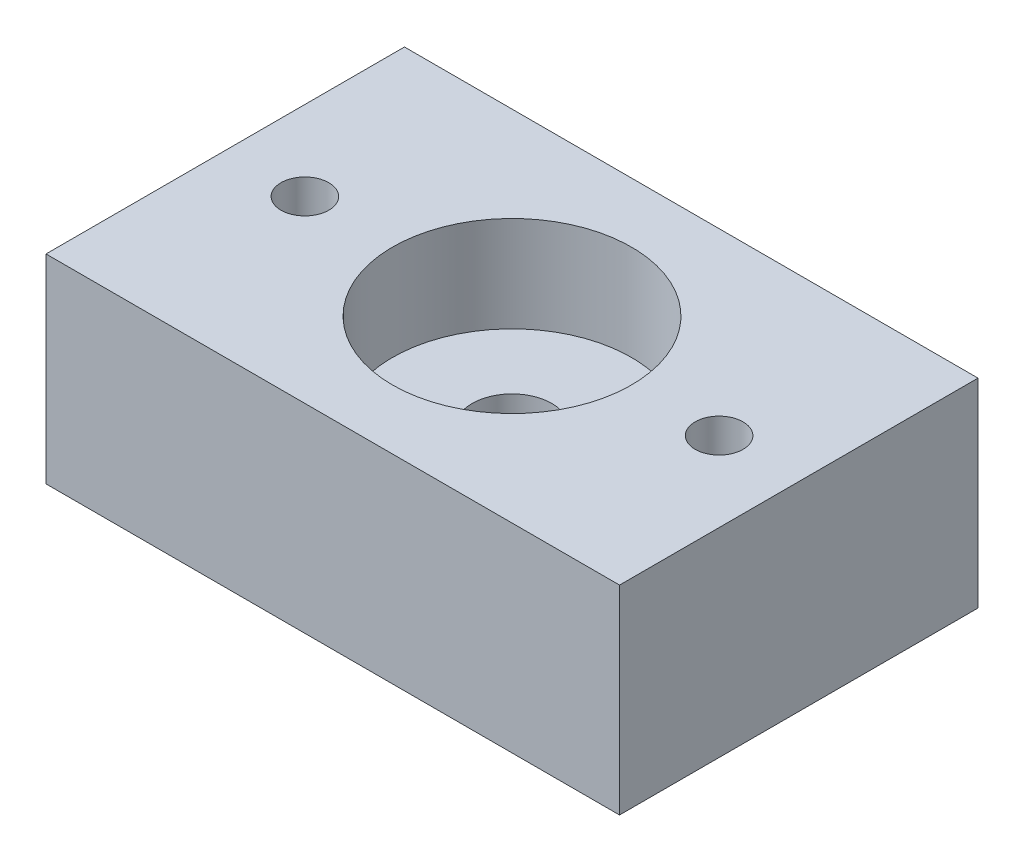
ISO-10303-21;
HEADER;
FILE_DESCRIPTION(('STEP AP214'),'2;1');
FILE_NAME('part.step','',(''),(''),'','','');
FILE_SCHEMA(('AUTOMOTIVE_DESIGN { 1 0 10303 214 1 1 1 1 }'));
ENDSEC;
DATA;
#1=APPLICATION_CONTEXT('core data for automotive mechanical design processes');
#2=APPLICATION_PROTOCOL_DEFINITION('international standard','automotive_design',2000,#1);
#3=PRODUCT_CONTEXT('',#1,'mechanical');
#4=PRODUCT('Part','Part','',(#3));
#5=PRODUCT_RELATED_PRODUCT_CATEGORY('part','',(#4));
#6=PRODUCT_DEFINITION_FORMATION('','',#4);
#7=PRODUCT_DEFINITION_CONTEXT('part definition',#1,'design');
#8=PRODUCT_DEFINITION('design','',#6,#7);
#9=PRODUCT_DEFINITION_SHAPE('','',#8);
#10=(LENGTH_UNIT() NAMED_UNIT(*) SI_UNIT(.MILLI.,.METRE.));
#11=(NAMED_UNIT(*) PLANE_ANGLE_UNIT() SI_UNIT($,.RADIAN.));
#12=(NAMED_UNIT(*) SI_UNIT($,.STERADIAN.) SOLID_ANGLE_UNIT());
#13=UNCERTAINTY_MEASURE_WITH_UNIT(LENGTH_MEASURE(1.E-05),#10,'distance_accuracy_value','');
#14=(GEOMETRIC_REPRESENTATION_CONTEXT(3) GLOBAL_UNCERTAINTY_ASSIGNED_CONTEXT((#13)) GLOBAL_UNIT_ASSIGNED_CONTEXT((#10,
#11,#12)) REPRESENTATION_CONTEXT('',''));
#15=CARTESIAN_POINT('',(0.,0.,0.));
#16=DIRECTION('',(0.,0.,1.));
#17=DIRECTION('',(1.,0.,0.));
#18=AXIS2_PLACEMENT_3D('',#15,#16,#17);
#19=CARTESIAN_POINT('',(0.,0.,0.));
#20=DIRECTION('',(0.,1.,0.));
#21=DIRECTION('',(0.,0.,1.));
#22=AXIS2_PLACEMENT_3D('',#19,#20,#21);
#23=CYLINDRICAL_SURFACE('',#22,5.);
#24=CARTESIAN_POINT('',(0.,0.,0.));
#25=DIRECTION('',(0.,1.,0.));
#26=DIRECTION('',(0.,0.,1.));
#27=AXIS2_PLACEMENT_3D('',#24,#25,#26);
#28=CIRCLE('',#27,5.);
#29=CARTESIAN_POINT('',(0.,0.,5.));
#30=VERTEX_POINT('',#29);
#31=EDGE_CURVE('E114',#30,#30,#28,.T.);
#32=ORIENTED_EDGE('',*,*,#31,.F.);
#33=EDGE_LOOP('',(#32));
#34=FACE_BOUND('',#33,.T.);
#35=CARTESIAN_POINT('',(0.,13.,0.));
#36=DIRECTION('',(0.,1.,0.));
#37=DIRECTION('',(0.,0.,1.));
#38=AXIS2_PLACEMENT_3D('',#35,#36,#37);
#39=CIRCLE('',#38,5.);
#40=CARTESIAN_POINT('',(0.,13.,5.));
#41=VERTEX_POINT('',#40);
#42=EDGE_CURVE('E43',#41,#41,#39,.F.);
#43=ORIENTED_EDGE('',*,*,#42,.F.);
#44=EDGE_LOOP('',(#43));
#45=FACE_BOUND('',#44,.T.);
#46=ADVANCED_FACE('F39',(#34,#45),#23,.F.);
#47=CARTESIAN_POINT('',(36.,25.,-22.5));
#48=DIRECTION('',(-1.,0.,0.));
#49=DIRECTION('',(0.,0.,1.));
#50=AXIS2_PLACEMENT_3D('',#47,#48,#49);
#51=PLANE('',#50);
#52=DIRECTION('',(0.,0.,-1.));
#53=VECTOR('',#52,1.);
#54=CARTESIAN_POINT('',(36.,0.,-22.5));
#55=LINE('',#54,#53);
#56=CARTESIAN_POINT('',(36.,0.,22.5));
#57=VERTEX_POINT('',#56);
#58=CARTESIAN_POINT('',(36.,0.,-22.5));
#59=VERTEX_POINT('',#58);
#60=EDGE_CURVE('E110',#57,#59,#55,.T.);
#61=ORIENTED_EDGE('',*,*,#60,.T.);
#62=DIRECTION('',(0.,-1.,0.));
#63=VECTOR('',#62,1.);
#64=CARTESIAN_POINT('',(36.,25.,-22.5));
#65=LINE('',#64,#63);
#66=CARTESIAN_POINT('',(36.,25.,-22.5));
#67=VERTEX_POINT('',#66);
#68=EDGE_CURVE('E11',#67,#59,#65,.T.);
#69=ORIENTED_EDGE('',*,*,#68,.F.);
#70=DIRECTION('',(0.,0.,-1.));
#71=VECTOR('',#70,1.);
#72=CARTESIAN_POINT('',(36.,25.,-22.5));
#73=LINE('',#72,#71);
#74=CARTESIAN_POINT('',(36.,25.,22.5));
#75=VERTEX_POINT('',#74);
#76=EDGE_CURVE('E93',#75,#67,#73,.T.);
#77=ORIENTED_EDGE('',*,*,#76,.F.);
#78=DIRECTION('',(0.,-1.,0.));
#79=VECTOR('',#78,1.);
#80=CARTESIAN_POINT('',(36.,25.,22.5));
#81=LINE('',#80,#79);
#82=EDGE_CURVE('E106',#75,#57,#81,.T.);
#83=ORIENTED_EDGE('',*,*,#82,.T.);
#84=EDGE_LOOP('',(#61,#69,#77,#83));
#85=FACE_BOUND('',#84,.T.);
#86=ADVANCED_FACE('F41',(#85),#51,.F.);
#87=CARTESIAN_POINT('',(-36.,25.,-22.5));
#88=DIRECTION('',(0.,0.,1.));
#89=DIRECTION('',(1.,0.,0.));
#90=AXIS2_PLACEMENT_3D('',#87,#88,#89);
#91=PLANE('',#90);
#92=DIRECTION('',(-1.,0.,0.));
#93=VECTOR('',#92,1.);
#94=CARTESIAN_POINT('',(-36.,0.,-22.5));
#95=LINE('',#94,#93);
#96=CARTESIAN_POINT('',(-36.,0.,-22.5));
#97=VERTEX_POINT('',#96);
#98=EDGE_CURVE('E98',#59,#97,#95,.T.);
#99=ORIENTED_EDGE('',*,*,#98,.T.);
#100=DIRECTION('',(0.,-1.,0.));
#101=VECTOR('',#100,1.);
#102=CARTESIAN_POINT('',(-36.,25.,-22.5));
#103=LINE('',#102,#101);
#104=CARTESIAN_POINT('',(-36.,25.,-22.5));
#105=VERTEX_POINT('',#104);
#106=EDGE_CURVE('E50',#105,#97,#103,.T.);
#107=ORIENTED_EDGE('',*,*,#106,.F.);
#108=DIRECTION('',(-1.,0.,0.));
#109=VECTOR('',#108,1.);
#110=CARTESIAN_POINT('',(-36.,25.,-22.5));
#111=LINE('',#110,#109);
#112=EDGE_CURVE('E88',#67,#105,#111,.T.);
#113=ORIENTED_EDGE('',*,*,#112,.F.);
#114=ORIENTED_EDGE('',*,*,#68,.T.);
#115=EDGE_LOOP('',(#99,#107,#113,#114));
#116=FACE_BOUND('',#115,.T.);
#117=ADVANCED_FACE('F97',(#116),#91,.F.);
#118=CARTESIAN_POINT('',(-36.,25.,-22.5));
#119=DIRECTION('',(1.,0.,0.));
#120=DIRECTION('',(0.,0.,-1.));
#121=AXIS2_PLACEMENT_3D('',#118,#119,#120);
#122=PLANE('',#121);
#123=DIRECTION('',(0.,0.,1.));
#124=VECTOR('',#123,1.);
#125=CARTESIAN_POINT('',(-36.,0.,-22.5));
#126=LINE('',#125,#124);
#127=CARTESIAN_POINT('',(-36.,0.,22.5));
#128=VERTEX_POINT('',#127);
#129=EDGE_CURVE('E75',#97,#128,#126,.T.);
#130=ORIENTED_EDGE('',*,*,#129,.T.);
#131=DIRECTION('',(0.,-1.,0.));
#132=VECTOR('',#131,1.);
#133=CARTESIAN_POINT('',(-36.,25.,22.5));
#134=LINE('',#133,#132);
#135=CARTESIAN_POINT('',(-36.,25.,22.5));
#136=VERTEX_POINT('',#135);
#137=EDGE_CURVE('E100',#136,#128,#134,.T.);
#138=ORIENTED_EDGE('',*,*,#137,.F.);
#139=DIRECTION('',(0.,0.,1.));
#140=VECTOR('',#139,1.);
#141=CARTESIAN_POINT('',(-36.,25.,-22.5));
#142=LINE('',#141,#140);
#143=EDGE_CURVE('E91',#105,#136,#142,.T.);
#144=ORIENTED_EDGE('',*,*,#143,.F.);
#145=ORIENTED_EDGE('',*,*,#106,.T.);
#146=EDGE_LOOP('',(#130,#138,#144,#145));
#147=FACE_BOUND('',#146,.T.);
#148=ADVANCED_FACE('F102',(#147),#122,.F.);
#149=CARTESIAN_POINT('',(-36.,25.,22.5));
#150=DIRECTION('',(0.,0.,-1.));
#151=DIRECTION('',(-1.,0.,0.));
#152=AXIS2_PLACEMENT_3D('',#149,#150,#151);
#153=PLANE('',#152);
#154=DIRECTION('',(1.,0.,0.));
#155=VECTOR('',#154,1.);
#156=CARTESIAN_POINT('',(-36.,0.,22.5));
#157=LINE('',#156,#155);
#158=EDGE_CURVE('E81',#128,#57,#157,.T.);
#159=ORIENTED_EDGE('',*,*,#158,.T.);
#160=ORIENTED_EDGE('',*,*,#82,.F.);
#161=DIRECTION('',(1.,0.,0.));
#162=VECTOR('',#161,1.);
#163=CARTESIAN_POINT('',(-36.,25.,22.5));
#164=LINE('',#163,#162);
#165=EDGE_CURVE('E58',#136,#75,#164,.T.);
#166=ORIENTED_EDGE('',*,*,#165,.F.);
#167=ORIENTED_EDGE('',*,*,#137,.T.);
#168=EDGE_LOOP('',(#159,#160,#166,#167));
#169=FACE_BOUND('',#168,.T.);
#170=ADVANCED_FACE('F124',(#169),#153,.F.);
#171=CARTESIAN_POINT('',(0.,25.,0.));
#172=DIRECTION('',(0.,1.,0.));
#173=DIRECTION('',(0.,0.,1.));
#174=AXIS2_PLACEMENT_3D('',#171,#172,#173);
#175=PLANE('',#174);
#176=CARTESIAN_POINT('',(0.,25.,0.));
#177=DIRECTION('',(0.,1.,0.));
#178=DIRECTION('',(0.,0.,1.));
#179=AXIS2_PLACEMENT_3D('',#176,#177,#178);
#180=CIRCLE('',#179,15.);
#181=CARTESIAN_POINT('',(0.,25.,15.));
#182=VERTEX_POINT('',#181);
#183=EDGE_CURVE('E150',#182,#182,#180,.T.);
#184=ORIENTED_EDGE('',*,*,#183,.F.);
#185=EDGE_LOOP('',(#184));
#186=FACE_BOUND('',#185,.T.);
#187=CARTESIAN_POINT('',(-26.,25.,0.));
#188=DIRECTION('',(0.,1.,0.));
#189=DIRECTION('',(0.,0.,1.));
#190=AXIS2_PLACEMENT_3D('',#187,#188,#189);
#191=CIRCLE('',#190,3.);
#192=CARTESIAN_POINT('',(-26.,25.,3.));
#193=VERTEX_POINT('',#192);
#194=EDGE_CURVE('E143',#193,#193,#191,.T.);
#195=ORIENTED_EDGE('',*,*,#194,.F.);
#196=EDGE_LOOP('',(#195));
#197=FACE_BOUND('',#196,.T.);
#198=CARTESIAN_POINT('',(26.,25.,0.));
#199=DIRECTION('',(0.,1.,0.));
#200=DIRECTION('',(0.,0.,-1.));
#201=AXIS2_PLACEMENT_3D('',#198,#199,#200);
#202=CIRCLE('',#201,3.);
#203=CARTESIAN_POINT('',(26.,25.,-3.00000000000001));
#204=VERTEX_POINT('',#203);
#205=EDGE_CURVE('E135',#204,#204,#202,.T.);
#206=ORIENTED_EDGE('',*,*,#205,.F.);
#207=EDGE_LOOP('',(#206));
#208=FACE_BOUND('',#207,.T.);
#209=ORIENTED_EDGE('',*,*,#76,.T.);
#210=ORIENTED_EDGE('',*,*,#112,.T.);
#211=ORIENTED_EDGE('',*,*,#143,.T.);
#212=ORIENTED_EDGE('',*,*,#165,.T.);
#213=EDGE_LOOP('',(#209,#210,#211,#212));
#214=FACE_BOUND('',#213,.T.);
#215=ADVANCED_FACE('F89',(#186,#197,#208,#214),#175,.T.);
#216=CARTESIAN_POINT('',(0.,0.,0.));
#217=DIRECTION('',(0.,1.,0.));
#218=DIRECTION('',(0.,0.,1.));
#219=AXIS2_PLACEMENT_3D('',#216,#217,#218);
#220=PLANE('',#219);
#221=CARTESIAN_POINT('',(-26.,0.,0.));
#222=DIRECTION('',(0.,1.,0.));
#223=DIRECTION('',(0.,0.,1.));
#224=AXIS2_PLACEMENT_3D('',#221,#222,#223);
#225=CIRCLE('',#224,3.);
#226=CARTESIAN_POINT('',(-26.,0.,3.));
#227=VERTEX_POINT('',#226);
#228=EDGE_CURVE('E134',#227,#227,#225,.T.);
#229=ORIENTED_EDGE('',*,*,#228,.T.);
#230=EDGE_LOOP('',(#229));
#231=FACE_BOUND('',#230,.T.);
#232=CARTESIAN_POINT('',(26.,0.,0.));
#233=DIRECTION('',(0.,1.,0.));
#234=DIRECTION('',(0.,0.,-1.));
#235=AXIS2_PLACEMENT_3D('',#232,#233,#234);
#236=CIRCLE('',#235,3.);
#237=CARTESIAN_POINT('',(26.,0.,-3.00000000000001));
#238=VERTEX_POINT('',#237);
#239=EDGE_CURVE('E139',#238,#238,#236,.T.);
#240=ORIENTED_EDGE('',*,*,#239,.T.);
#241=EDGE_LOOP('',(#240));
#242=FACE_BOUND('',#241,.T.);
#243=ORIENTED_EDGE('',*,*,#31,.T.);
#244=EDGE_LOOP('',(#243));
#245=FACE_BOUND('',#244,.T.);
#246=ORIENTED_EDGE('',*,*,#60,.F.);
#247=ORIENTED_EDGE('',*,*,#158,.F.);
#248=ORIENTED_EDGE('',*,*,#129,.F.);
#249=ORIENTED_EDGE('',*,*,#98,.F.);
#250=EDGE_LOOP('',(#246,#247,#248,#249));
#251=FACE_BOUND('',#250,.T.);
#252=ADVANCED_FACE('F127',(#231,#242,#245,#251),#220,.F.);
#253=CARTESIAN_POINT('',(26.,0.,0.));
#254=DIRECTION('',(0.,1.,0.));
#255=DIRECTION('',(0.,0.,1.));
#256=AXIS2_PLACEMENT_3D('',#253,#254,#255);
#257=CYLINDRICAL_SURFACE('',#256,3.);
#258=ORIENTED_EDGE('',*,*,#239,.F.);
#259=EDGE_LOOP('',(#258));
#260=FACE_BOUND('',#259,.T.);
#261=ORIENTED_EDGE('',*,*,#205,.T.);
#262=EDGE_LOOP('',(#261));
#263=FACE_BOUND('',#262,.T.);
#264=ADVANCED_FACE('F174',(#260,#263),#257,.F.);
#265=CARTESIAN_POINT('',(-26.,0.,0.));
#266=DIRECTION('',(0.,1.,0.));
#267=DIRECTION('',(0.,0.,1.));
#268=AXIS2_PLACEMENT_3D('',#265,#266,#267);
#269=CYLINDRICAL_SURFACE('',#268,3.);
#270=ORIENTED_EDGE('',*,*,#228,.F.);
#271=EDGE_LOOP('',(#270));
#272=FACE_BOUND('',#271,.T.);
#273=ORIENTED_EDGE('',*,*,#194,.T.);
#274=EDGE_LOOP('',(#273));
#275=FACE_BOUND('',#274,.T.);
#276=ADVANCED_FACE('F213',(#272,#275),#269,.F.);
#277=CARTESIAN_POINT('',(0.,13.,0.));
#278=DIRECTION('',(0.,1.,0.));
#279=DIRECTION('',(0.,0.,1.));
#280=AXIS2_PLACEMENT_3D('',#277,#278,#279);
#281=PLANE('',#280);
#282=CARTESIAN_POINT('',(0.,13.,0.));
#283=DIRECTION('',(0.,1.,0.));
#284=DIRECTION('',(0.,0.,1.));
#285=AXIS2_PLACEMENT_3D('',#282,#283,#284);
#286=CIRCLE('',#285,15.);
#287=CARTESIAN_POINT('',(0.,13.,15.));
#288=VERTEX_POINT('',#287);
#289=EDGE_CURVE('E154',#288,#288,#286,.T.);
#290=ORIENTED_EDGE('',*,*,#289,.T.);
#291=EDGE_LOOP('',(#290));
#292=FACE_BOUND('',#291,.T.);
#293=ORIENTED_EDGE('',*,*,#42,.T.);
#294=EDGE_LOOP('',(#293));
#295=FACE_BOUND('',#294,.T.);
#296=ADVANCED_FACE('F163',(#292,#295),#281,.T.);
#297=CARTESIAN_POINT('',(0.,13.,0.));
#298=DIRECTION('',(0.,1.,0.));
#299=DIRECTION('',(0.,0.,1.));
#300=AXIS2_PLACEMENT_3D('',#297,#298,#299);
#301=CYLINDRICAL_SURFACE('',#300,15.);
#302=ORIENTED_EDGE('',*,*,#289,.F.);
#303=EDGE_LOOP('',(#302));
#304=FACE_BOUND('',#303,.T.);
#305=ORIENTED_EDGE('',*,*,#183,.T.);
#306=EDGE_LOOP('',(#305));
#307=FACE_BOUND('',#306,.T.);
#308=ADVANCED_FACE('F225',(#304,#307),#301,.F.);
#309=CLOSED_SHELL('',(#46,#86,#117,#148,#170,#215,#252,#264,#276,#296,#308));
#310=MANIFOLD_SOLID_BREP('B2',#309);
#311=ADVANCED_BREP_SHAPE_REPRESENTATION('',(#18,#310),#14);
#312=SHAPE_DEFINITION_REPRESENTATION(#9,#311);
ENDSEC;
END-ISO-10303-21;
